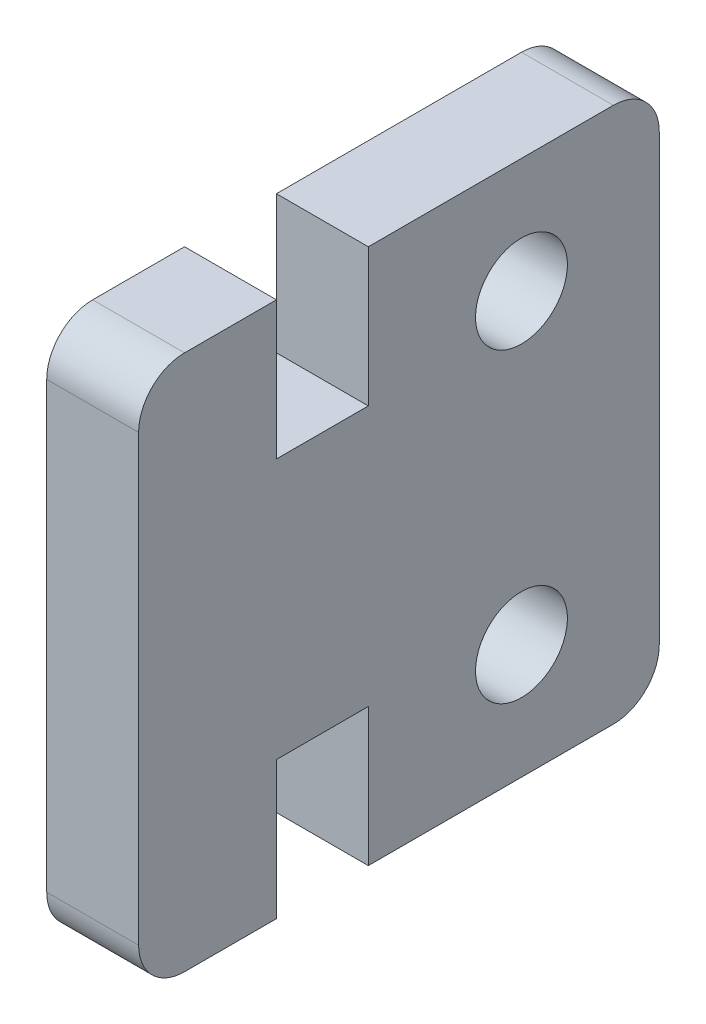
ISO-10303-21;
HEADER;
FILE_DESCRIPTION(('STEP AP214'),'2;1');
FILE_NAME('part.step','',(''),(''),'','','');
FILE_SCHEMA(('AUTOMOTIVE_DESIGN { 1 0 10303 214 1 1 1 1 }'));
ENDSEC;
DATA;
#1=APPLICATION_CONTEXT('core data for automotive mechanical design processes');
#2=APPLICATION_PROTOCOL_DEFINITION('international standard','automotive_design',2000,#1);
#3=PRODUCT_CONTEXT('',#1,'mechanical');
#4=PRODUCT('Part','Part','',(#3));
#5=PRODUCT_RELATED_PRODUCT_CATEGORY('part','',(#4));
#6=PRODUCT_DEFINITION_FORMATION('','',#4);
#7=PRODUCT_DEFINITION_CONTEXT('part definition',#1,'design');
#8=PRODUCT_DEFINITION('design','',#6,#7);
#9=PRODUCT_DEFINITION_SHAPE('','',#8);
#10=(LENGTH_UNIT() NAMED_UNIT(*) SI_UNIT(.MILLI.,.METRE.));
#11=(NAMED_UNIT(*) PLANE_ANGLE_UNIT() SI_UNIT($,.RADIAN.));
#12=(NAMED_UNIT(*) SI_UNIT($,.STERADIAN.) SOLID_ANGLE_UNIT());
#13=UNCERTAINTY_MEASURE_WITH_UNIT(LENGTH_MEASURE(1.E-05),#10,'distance_accuracy_value','');
#14=(GEOMETRIC_REPRESENTATION_CONTEXT(3) GLOBAL_UNCERTAINTY_ASSIGNED_CONTEXT((#13)) GLOBAL_UNIT_ASSIGNED_CONTEXT((#10,
#11,#12)) REPRESENTATION_CONTEXT('',''));
#15=CARTESIAN_POINT('',(0.,0.,0.));
#16=DIRECTION('',(0.,0.,1.));
#17=DIRECTION('',(1.,0.,0.));
#18=AXIS2_PLACEMENT_3D('',#15,#16,#17);
#19=CARTESIAN_POINT('',(3.,0.,0.));
#20=DIRECTION('',(1.,0.,0.));
#21=DIRECTION('',(0.,0.,-1.));
#22=AXIS2_PLACEMENT_3D('',#19,#20,#21);
#23=PLANE('',#22);
#24=CARTESIAN_POINT('',(3.,5.,-5.));
#25=DIRECTION('',(-1.,0.,0.));
#26=DIRECTION('',(0.,0.,1.));
#27=AXIS2_PLACEMENT_3D('',#24,#25,#26);
#28=CIRCLE('',#27,1.5);
#29=CARTESIAN_POINT('',(3.,5.,-3.5));
#30=VERTEX_POINT('',#29);
#31=EDGE_CURVE('E252',#30,#30,#28,.T.);
#32=ORIENTED_EDGE('',*,*,#31,.T.);
#33=EDGE_LOOP('',(#32));
#34=FACE_BOUND('',#33,.T.);
#35=DIRECTION('',(0.,0.,1.));
#36=VECTOR('',#35,1.);
#37=CARTESIAN_POINT('',(3.,-4.25,3.));
#38=LINE('',#37,#36);
#39=CARTESIAN_POINT('',(3.,-4.25,3.));
#40=VERTEX_POINT('',#39);
#41=CARTESIAN_POINT('',(3.,-4.25,0.));
#42=VERTEX_POINT('',#41);
#43=EDGE_CURVE('E171',#40,#42,#38,.F.);
#44=ORIENTED_EDGE('',*,*,#43,.T.);
#45=DIRECTION('',(0.,1.,0.));
#46=VECTOR('',#45,1.);
#47=CARTESIAN_POINT('',(3.,-4.25,0.));
#48=LINE('',#47,#46);
#49=CARTESIAN_POINT('',(3.,-8.75,0.));
#50=VERTEX_POINT('',#49);
#51=EDGE_CURVE('E145',#42,#50,#48,.F.);
#52=ORIENTED_EDGE('',*,*,#51,.T.);
#53=DIRECTION('',(0.,0.,1.));
#54=VECTOR('',#53,1.);
#55=CARTESIAN_POINT('',(3.,-8.75,0.));
#56=LINE('',#55,#54);
#57=CARTESIAN_POINT('',(3.,-8.75,-8.));
#58=VERTEX_POINT('',#57);
#59=EDGE_CURVE('E141',#50,#58,#56,.F.);
#60=ORIENTED_EDGE('',*,*,#59,.T.);
#61=CARTESIAN_POINT('',(3.,-7.25,-8.));
#62=DIRECTION('',(-1.,0.,0.));
#63=DIRECTION('',(0.,0.,1.));
#64=AXIS2_PLACEMENT_3D('',#61,#62,#63);
#65=CIRCLE('',#64,1.5);
#66=CARTESIAN_POINT('',(3.,-7.25,-9.5));
#67=VERTEX_POINT('',#66);
#68=EDGE_CURVE('E254',#67,#58,#65,.T.);
#69=ORIENTED_EDGE('',*,*,#68,.F.);
#70=DIRECTION('',(0.,1.,0.));
#71=VECTOR('',#70,1.);
#72=CARTESIAN_POINT('',(3.,8.75,-9.5));
#73=LINE('',#72,#71);
#74=CARTESIAN_POINT('',(3.,7.25,-9.5));
#75=VERTEX_POINT('',#74);
#76=EDGE_CURVE('E250',#67,#75,#73,.T.);
#77=ORIENTED_EDGE('',*,*,#76,.T.);
#78=CARTESIAN_POINT('',(3.,7.25,-8.));
#79=DIRECTION('',(-1.,0.,0.));
#80=DIRECTION('',(0.,0.,1.));
#81=AXIS2_PLACEMENT_3D('',#78,#79,#80);
#82=CIRCLE('',#81,1.5);
#83=CARTESIAN_POINT('',(3.,8.75,-8.));
#84=VERTEX_POINT('',#83);
#85=EDGE_CURVE('E89',#84,#75,#82,.T.);
#86=ORIENTED_EDGE('',*,*,#85,.F.);
#87=DIRECTION('',(0.,0.,-1.));
#88=VECTOR('',#87,1.);
#89=CARTESIAN_POINT('',(3.,8.75,0.));
#90=LINE('',#89,#88);
#91=CARTESIAN_POINT('',(3.,8.75,0.));
#92=VERTEX_POINT('',#91);
#93=EDGE_CURVE('E93',#84,#92,#90,.F.);
#94=ORIENTED_EDGE('',*,*,#93,.T.);
#95=DIRECTION('',(0.,1.,0.));
#96=VECTOR('',#95,1.);
#97=CARTESIAN_POINT('',(3.,4.25,0.));
#98=LINE('',#97,#96);
#99=CARTESIAN_POINT('',(3.,4.25,0.));
#100=VERTEX_POINT('',#99);
#101=EDGE_CURVE('E234',#92,#100,#98,.F.);
#102=ORIENTED_EDGE('',*,*,#101,.T.);
#103=DIRECTION('',(0.,0.,-1.));
#104=VECTOR('',#103,1.);
#105=CARTESIAN_POINT('',(3.,4.25,3.));
#106=LINE('',#105,#104);
#107=CARTESIAN_POINT('',(3.,4.25,3.));
#108=VERTEX_POINT('',#107);
#109=EDGE_CURVE('E223',#100,#108,#106,.F.);
#110=ORIENTED_EDGE('',*,*,#109,.T.);
#111=DIRECTION('',(0.,1.,0.));
#112=VECTOR('',#111,1.);
#113=CARTESIAN_POINT('',(3.,8.75,3.));
#114=LINE('',#113,#112);
#115=CARTESIAN_POINT('',(3.,8.75,3.));
#116=VERTEX_POINT('',#115);
#117=EDGE_CURVE('E210',#108,#116,#114,.T.);
#118=ORIENTED_EDGE('',*,*,#117,.T.);
#119=DIRECTION('',(0.,0.,-1.));
#120=VECTOR('',#119,1.);
#121=CARTESIAN_POINT('',(3.,8.75,7.5));
#122=LINE('',#121,#120);
#123=CARTESIAN_POINT('',(3.,8.75,6.));
#124=VERTEX_POINT('',#123);
#125=EDGE_CURVE('E209',#116,#124,#122,.F.);
#126=ORIENTED_EDGE('',*,*,#125,.T.);
#127=CARTESIAN_POINT('',(3.,7.25,6.));
#128=DIRECTION('',(-1.,0.,0.));
#129=DIRECTION('',(0.,0.,1.));
#130=AXIS2_PLACEMENT_3D('',#127,#128,#129);
#131=CIRCLE('',#130,1.5);
#132=CARTESIAN_POINT('',(3.,7.25,7.5));
#133=VERTEX_POINT('',#132);
#134=EDGE_CURVE('E205',#133,#124,#131,.T.);
#135=ORIENTED_EDGE('',*,*,#134,.F.);
#136=DIRECTION('',(0.,1.,0.));
#137=VECTOR('',#136,1.);
#138=CARTESIAN_POINT('',(3.,-8.75,7.5));
#139=LINE('',#138,#137);
#140=CARTESIAN_POINT('',(3.,-7.25,7.5));
#141=VERTEX_POINT('',#140);
#142=EDGE_CURVE('E202',#133,#141,#139,.F.);
#143=ORIENTED_EDGE('',*,*,#142,.T.);
#144=CARTESIAN_POINT('',(3.,-7.25,6.));
#145=DIRECTION('',(-1.,0.,0.));
#146=DIRECTION('',(0.,0.,1.));
#147=AXIS2_PLACEMENT_3D('',#144,#145,#146);
#148=CIRCLE('',#147,1.5);
#149=CARTESIAN_POINT('',(3.,-8.75,6.));
#150=VERTEX_POINT('',#149);
#151=EDGE_CURVE('E198',#150,#141,#148,.T.);
#152=ORIENTED_EDGE('',*,*,#151,.F.);
#153=DIRECTION('',(0.,0.,1.));
#154=VECTOR('',#153,1.);
#155=CARTESIAN_POINT('',(3.,-8.75,3.));
#156=LINE('',#155,#154);
#157=CARTESIAN_POINT('',(3.,-8.75,3.));
#158=VERTEX_POINT('',#157);
#159=EDGE_CURVE('E190',#150,#158,#156,.F.);
#160=ORIENTED_EDGE('',*,*,#159,.T.);
#161=DIRECTION('',(0.,1.,0.));
#162=VECTOR('',#161,1.);
#163=CARTESIAN_POINT('',(3.,-4.25,3.));
#164=LINE('',#163,#162);
#165=EDGE_CURVE('E179',#158,#40,#164,.T.);
#166=ORIENTED_EDGE('',*,*,#165,.T.);
#167=EDGE_LOOP('',(#44,#52,#60,#69,#77,#86,#94,#102,#110,#118,#126,#135,#143,#152,#160,#166));
#168=FACE_BOUND('',#167,.T.);
#169=CARTESIAN_POINT('',(3.,-5.,-5.));
#170=DIRECTION('',(-1.,0.,0.));
#171=DIRECTION('',(0.,0.,1.));
#172=AXIS2_PLACEMENT_3D('',#169,#170,#171);
#173=CIRCLE('',#172,1.5);
#174=CARTESIAN_POINT('',(3.,-5.,-3.5));
#175=VERTEX_POINT('',#174);
#176=EDGE_CURVE('E19',#175,#175,#173,.T.);
#177=ORIENTED_EDGE('',*,*,#176,.T.);
#178=EDGE_LOOP('',(#177));
#179=FACE_BOUND('',#178,.T.);
#180=ADVANCED_FACE('F16',(#34,#168,#179),#23,.T.);
#181=CARTESIAN_POINT('',(3.,-5.,-5.));
#182=DIRECTION('',(-1.,0.,0.));
#183=DIRECTION('',(0.,0.,1.));
#184=AXIS2_PLACEMENT_3D('',#181,#182,#183);
#185=CYLINDRICAL_SURFACE('',#184,1.5);
#186=CARTESIAN_POINT('',(0.,-5.,-5.));
#187=DIRECTION('',(-1.,0.,0.));
#188=DIRECTION('',(0.,0.,1.));
#189=AXIS2_PLACEMENT_3D('',#186,#187,#188);
#190=CIRCLE('',#189,1.5);
#191=CARTESIAN_POINT('',(0.,-5.,-3.5));
#192=VERTEX_POINT('',#191);
#193=EDGE_CURVE('E298',#192,#192,#190,.T.);
#194=ORIENTED_EDGE('',*,*,#193,.T.);
#195=EDGE_LOOP('',(#194));
#196=FACE_BOUND('',#195,.T.);
#197=ORIENTED_EDGE('',*,*,#176,.F.);
#198=EDGE_LOOP('',(#197));
#199=FACE_BOUND('',#198,.T.);
#200=ADVANCED_FACE('F313',(#196,#199),#185,.F.);
#201=CARTESIAN_POINT('',(3.,7.25,-8.));
#202=DIRECTION('',(-1.,0.,0.));
#203=DIRECTION('',(0.,0.,1.));
#204=AXIS2_PLACEMENT_3D('',#201,#202,#203);
#205=CYLINDRICAL_SURFACE('',#204,1.5);
#206=CARTESIAN_POINT('',(0.,7.25,-8.));
#207=DIRECTION('',(-1.,0.,0.));
#208=DIRECTION('',(0.,0.,1.));
#209=AXIS2_PLACEMENT_3D('',#206,#207,#208);
#210=CIRCLE('',#209,1.5);
#211=CARTESIAN_POINT('',(0.,7.25,-9.5));
#212=VERTEX_POINT('',#211);
#213=CARTESIAN_POINT('',(0.,8.75,-8.));
#214=VERTEX_POINT('',#213);
#215=EDGE_CURVE('E295',#212,#214,#210,.F.);
#216=ORIENTED_EDGE('',*,*,#215,.T.);
#217=DIRECTION('',(1.,0.,0.));
#218=VECTOR('',#217,1.);
#219=CARTESIAN_POINT('',(3.,8.75,-8.));
#220=LINE('',#219,#218);
#221=EDGE_CURVE('E247',#214,#84,#220,.T.);
#222=ORIENTED_EDGE('',*,*,#221,.T.);
#223=ORIENTED_EDGE('',*,*,#85,.T.);
#224=DIRECTION('',(1.,0.,0.));
#225=VECTOR('',#224,1.);
#226=CARTESIAN_POINT('',(3.,7.25,-9.5));
#227=LINE('',#226,#225);
#228=EDGE_CURVE('E396',#75,#212,#227,.F.);
#229=ORIENTED_EDGE('',*,*,#228,.T.);
#230=EDGE_LOOP('',(#216,#222,#223,#229));
#231=FACE_BOUND('',#230,.T.);
#232=ADVANCED_FACE('F315',(#231),#205,.T.);
#233=CARTESIAN_POINT('',(3.,8.75,0.));
#234=DIRECTION('',(0.,-1.,0.));
#235=DIRECTION('',(0.,0.,-1.));
#236=AXIS2_PLACEMENT_3D('',#233,#234,#235);
#237=PLANE('',#236);
#238=ORIENTED_EDGE('',*,*,#221,.F.);
#239=DIRECTION('',(0.,0.,-1.));
#240=VECTOR('',#239,1.);
#241=CARTESIAN_POINT('',(0.,8.75,0.));
#242=LINE('',#241,#240);
#243=CARTESIAN_POINT('',(0.,8.75,0.));
#244=VERTEX_POINT('',#243);
#245=EDGE_CURVE('E239',#214,#244,#242,.F.);
#246=ORIENTED_EDGE('',*,*,#245,.T.);
#247=DIRECTION('',(1.,0.,0.));
#248=VECTOR('',#247,1.);
#249=CARTESIAN_POINT('',(3.,8.75,0.));
#250=LINE('',#249,#248);
#251=EDGE_CURVE('E242',#244,#92,#250,.T.);
#252=ORIENTED_EDGE('',*,*,#251,.T.);
#253=ORIENTED_EDGE('',*,*,#93,.F.);
#254=EDGE_LOOP('',(#238,#246,#252,#253));
#255=FACE_BOUND('',#254,.T.);
#256=ADVANCED_FACE('F322',(#255),#237,.F.);
#257=CARTESIAN_POINT('',(3.,4.25,0.));
#258=DIRECTION('',(0.,0.,-1.));
#259=DIRECTION('',(0.,1.,0.));
#260=AXIS2_PLACEMENT_3D('',#257,#258,#259);
#261=PLANE('',#260);
#262=DIRECTION('',(1.,0.,0.));
#263=VECTOR('',#262,1.);
#264=CARTESIAN_POINT('',(3.,4.25,0.));
#265=LINE('',#264,#263);
#266=CARTESIAN_POINT('',(0.,4.25,0.));
#267=VERTEX_POINT('',#266);
#268=EDGE_CURVE('E231',#267,#100,#265,.T.);
#269=ORIENTED_EDGE('',*,*,#268,.T.);
#270=ORIENTED_EDGE('',*,*,#101,.F.);
#271=ORIENTED_EDGE('',*,*,#251,.F.);
#272=DIRECTION('',(0.,1.,0.));
#273=VECTOR('',#272,1.);
#274=CARTESIAN_POINT('',(0.,0.,0.));
#275=LINE('',#274,#273);
#276=EDGE_CURVE('E228',#244,#267,#275,.F.);
#277=ORIENTED_EDGE('',*,*,#276,.T.);
#278=EDGE_LOOP('',(#269,#270,#271,#277));
#279=FACE_BOUND('',#278,.T.);
#280=ADVANCED_FACE('F382',(#279),#261,.F.);
#281=CARTESIAN_POINT('',(3.,4.25,3.));
#282=DIRECTION('',(0.,-1.,0.));
#283=DIRECTION('',(0.,0.,-1.));
#284=AXIS2_PLACEMENT_3D('',#281,#282,#283);
#285=PLANE('',#284);
#286=DIRECTION('',(1.,0.,0.));
#287=VECTOR('',#286,1.);
#288=CARTESIAN_POINT('',(3.,4.25,3.));
#289=LINE('',#288,#287);
#290=CARTESIAN_POINT('',(0.,4.25,3.));
#291=VERTEX_POINT('',#290);
#292=EDGE_CURVE('E220',#291,#108,#289,.T.);
#293=ORIENTED_EDGE('',*,*,#292,.T.);
#294=ORIENTED_EDGE('',*,*,#109,.F.);
#295=ORIENTED_EDGE('',*,*,#268,.F.);
#296=DIRECTION('',(0.,0.,-1.));
#297=VECTOR('',#296,1.);
#298=CARTESIAN_POINT('',(0.,4.25,0.));
#299=LINE('',#298,#297);
#300=EDGE_CURVE('E217',#267,#291,#299,.F.);
#301=ORIENTED_EDGE('',*,*,#300,.T.);
#302=EDGE_LOOP('',(#293,#294,#295,#301));
#303=FACE_BOUND('',#302,.T.);
#304=ADVANCED_FACE('F378',(#303),#285,.F.);
#305=CARTESIAN_POINT('',(3.,8.75,3.));
#306=DIRECTION('',(0.,0.,1.));
#307=DIRECTION('',(1.,0.,0.));
#308=AXIS2_PLACEMENT_3D('',#305,#306,#307);
#309=PLANE('',#308);
#310=DIRECTION('',(1.,0.,0.));
#311=VECTOR('',#310,1.);
#312=CARTESIAN_POINT('',(3.,8.75,3.));
#313=LINE('',#312,#311);
#314=CARTESIAN_POINT('',(0.,8.75,3.));
#315=VERTEX_POINT('',#314);
#316=EDGE_CURVE('E206',#315,#116,#313,.T.);
#317=ORIENTED_EDGE('',*,*,#316,.T.);
#318=ORIENTED_EDGE('',*,*,#117,.F.);
#319=ORIENTED_EDGE('',*,*,#292,.F.);
#320=DIRECTION('',(0.,1.,0.));
#321=VECTOR('',#320,1.);
#322=CARTESIAN_POINT('',(0.,0.,3.));
#323=LINE('',#322,#321);
#324=EDGE_CURVE('E213',#291,#315,#323,.T.);
#325=ORIENTED_EDGE('',*,*,#324,.T.);
#326=EDGE_LOOP('',(#317,#318,#319,#325));
#327=FACE_BOUND('',#326,.T.);
#328=ADVANCED_FACE('F374',(#327),#309,.F.);
#329=CARTESIAN_POINT('',(3.,8.75,7.5));
#330=DIRECTION('',(0.,-1.,0.));
#331=DIRECTION('',(0.,0.,-1.));
#332=AXIS2_PLACEMENT_3D('',#329,#330,#331);
#333=PLANE('',#332);
#334=DIRECTION('',(-1.,0.,0.));
#335=VECTOR('',#334,1.);
#336=CARTESIAN_POINT('',(3.,8.75,6.));
#337=LINE('',#336,#335);
#338=CARTESIAN_POINT('',(0.,8.75,6.));
#339=VERTEX_POINT('',#338);
#340=EDGE_CURVE('E203',#124,#339,#337,.T.);
#341=ORIENTED_EDGE('',*,*,#340,.F.);
#342=ORIENTED_EDGE('',*,*,#125,.F.);
#343=ORIENTED_EDGE('',*,*,#316,.F.);
#344=DIRECTION('',(0.,0.,-1.));
#345=VECTOR('',#344,1.);
#346=CARTESIAN_POINT('',(0.,8.75,0.));
#347=LINE('',#346,#345);
#348=EDGE_CURVE('E216',#315,#339,#347,.F.);
#349=ORIENTED_EDGE('',*,*,#348,.T.);
#350=EDGE_LOOP('',(#341,#342,#343,#349));
#351=FACE_BOUND('',#350,.T.);
#352=ADVANCED_FACE('F370',(#351),#333,.F.);
#353=CARTESIAN_POINT('',(3.,7.25,6.));
#354=DIRECTION('',(-1.,0.,0.));
#355=DIRECTION('',(0.,0.,1.));
#356=AXIS2_PLACEMENT_3D('',#353,#354,#355);
#357=CYLINDRICAL_SURFACE('',#356,1.5);
#358=CARTESIAN_POINT('',(0.,7.25,6.));
#359=DIRECTION('',(-1.,0.,0.));
#360=DIRECTION('',(0.,0.,1.));
#361=AXIS2_PLACEMENT_3D('',#358,#359,#360);
#362=CIRCLE('',#361,1.5);
#363=CARTESIAN_POINT('',(0.,7.25,7.5));
#364=VERTEX_POINT('',#363);
#365=EDGE_CURVE('E292',#339,#364,#362,.F.);
#366=ORIENTED_EDGE('',*,*,#365,.T.);
#367=DIRECTION('',(-1.,0.,0.));
#368=VECTOR('',#367,1.);
#369=CARTESIAN_POINT('',(3.,7.25,7.5));
#370=LINE('',#369,#368);
#371=EDGE_CURVE('E199',#364,#133,#370,.F.);
#372=ORIENTED_EDGE('',*,*,#371,.T.);
#373=ORIENTED_EDGE('',*,*,#134,.T.);
#374=ORIENTED_EDGE('',*,*,#340,.T.);
#375=EDGE_LOOP('',(#366,#372,#373,#374));
#376=FACE_BOUND('',#375,.T.);
#377=ADVANCED_FACE('F366',(#376),#357,.T.);
#378=CARTESIAN_POINT('',(3.,-8.75,7.5));
#379=DIRECTION('',(0.,0.,-1.));
#380=DIRECTION('',(-1.,0.,0.));
#381=AXIS2_PLACEMENT_3D('',#378,#379,#380);
#382=PLANE('',#381);
#383=DIRECTION('',(-1.,0.,0.));
#384=VECTOR('',#383,1.);
#385=CARTESIAN_POINT('',(3.,-7.25,7.5));
#386=LINE('',#385,#384);
#387=CARTESIAN_POINT('',(0.,-7.25,7.5));
#388=VERTEX_POINT('',#387);
#389=EDGE_CURVE('E196',#141,#388,#386,.T.);
#390=ORIENTED_EDGE('',*,*,#389,.F.);
#391=ORIENTED_EDGE('',*,*,#142,.F.);
#392=ORIENTED_EDGE('',*,*,#371,.F.);
#393=DIRECTION('',(0.,1.,0.));
#394=VECTOR('',#393,1.);
#395=CARTESIAN_POINT('',(0.,0.,7.5));
#396=LINE('',#395,#394);
#397=EDGE_CURVE('E291',#364,#388,#396,.F.);
#398=ORIENTED_EDGE('',*,*,#397,.T.);
#399=EDGE_LOOP('',(#390,#391,#392,#398));
#400=FACE_BOUND('',#399,.T.);
#401=ADVANCED_FACE('F362',(#400),#382,.F.);
#402=CARTESIAN_POINT('',(3.,-7.25,6.));
#403=DIRECTION('',(-1.,0.,0.));
#404=DIRECTION('',(0.,0.,1.));
#405=AXIS2_PLACEMENT_3D('',#402,#403,#404);
#406=CYLINDRICAL_SURFACE('',#405,1.5);
#407=CARTESIAN_POINT('',(0.,-7.25,6.));
#408=DIRECTION('',(-1.,0.,0.));
#409=DIRECTION('',(0.,0.,1.));
#410=AXIS2_PLACEMENT_3D('',#407,#408,#409);
#411=CIRCLE('',#410,1.5);
#412=CARTESIAN_POINT('',(0.,-8.75,6.));
#413=VERTEX_POINT('',#412);
#414=EDGE_CURVE('E288',#388,#413,#411,.F.);
#415=ORIENTED_EDGE('',*,*,#414,.T.);
#416=DIRECTION('',(1.,0.,0.));
#417=VECTOR('',#416,1.);
#418=CARTESIAN_POINT('',(3.,-8.75,6.));
#419=LINE('',#418,#417);
#420=EDGE_CURVE('E193',#413,#150,#419,.T.);
#421=ORIENTED_EDGE('',*,*,#420,.T.);
#422=ORIENTED_EDGE('',*,*,#151,.T.);
#423=ORIENTED_EDGE('',*,*,#389,.T.);
#424=EDGE_LOOP('',(#415,#421,#422,#423));
#425=FACE_BOUND('',#424,.T.);
#426=ADVANCED_FACE('F358',(#425),#406,.T.);
#427=CARTESIAN_POINT('',(3.,-8.75,3.));
#428=DIRECTION('',(0.,1.,0.));
#429=DIRECTION('',(0.,0.,1.));
#430=AXIS2_PLACEMENT_3D('',#427,#428,#429);
#431=PLANE('',#430);
#432=ORIENTED_EDGE('',*,*,#420,.F.);
#433=DIRECTION('',(0.,0.,-1.));
#434=VECTOR('',#433,1.);
#435=CARTESIAN_POINT('',(0.,-8.75,0.));
#436=LINE('',#435,#434);
#437=CARTESIAN_POINT('',(0.,-8.75,3.));
#438=VERTEX_POINT('',#437);
#439=EDGE_CURVE('E184',#413,#438,#436,.T.);
#440=ORIENTED_EDGE('',*,*,#439,.T.);
#441=DIRECTION('',(1.,0.,0.));
#442=VECTOR('',#441,1.);
#443=CARTESIAN_POINT('',(3.,-8.75,3.));
#444=LINE('',#443,#442);
#445=EDGE_CURVE('E187',#438,#158,#444,.T.);
#446=ORIENTED_EDGE('',*,*,#445,.T.);
#447=ORIENTED_EDGE('',*,*,#159,.F.);
#448=EDGE_LOOP('',(#432,#440,#446,#447));
#449=FACE_BOUND('',#448,.T.);
#450=ADVANCED_FACE('F354',(#449),#431,.F.);
#451=CARTESIAN_POINT('',(3.,-4.25,3.));
#452=DIRECTION('',(0.,0.,1.));
#453=DIRECTION('',(1.,0.,0.));
#454=AXIS2_PLACEMENT_3D('',#451,#452,#453);
#455=PLANE('',#454);
#456=DIRECTION('',(1.,0.,0.));
#457=VECTOR('',#456,1.);
#458=CARTESIAN_POINT('',(3.,-4.25,3.));
#459=LINE('',#458,#457);
#460=CARTESIAN_POINT('',(0.,-4.25,3.));
#461=VERTEX_POINT('',#460);
#462=EDGE_CURVE('E176',#461,#40,#459,.T.);
#463=ORIENTED_EDGE('',*,*,#462,.T.);
#464=ORIENTED_EDGE('',*,*,#165,.F.);
#465=ORIENTED_EDGE('',*,*,#445,.F.);
#466=DIRECTION('',(0.,1.,0.));
#467=VECTOR('',#466,1.);
#468=CARTESIAN_POINT('',(0.,0.,3.));
#469=LINE('',#468,#467);
#470=EDGE_CURVE('E163',#438,#461,#469,.T.);
#471=ORIENTED_EDGE('',*,*,#470,.T.);
#472=EDGE_LOOP('',(#463,#464,#465,#471));
#473=FACE_BOUND('',#472,.T.);
#474=ADVANCED_FACE('F350',(#473),#455,.F.);
#475=CARTESIAN_POINT('',(3.,-4.25,3.));
#476=DIRECTION('',(0.,1.,0.));
#477=DIRECTION('',(0.,0.,1.));
#478=AXIS2_PLACEMENT_3D('',#475,#476,#477);
#479=PLANE('',#478);
#480=DIRECTION('',(1.,0.,0.));
#481=VECTOR('',#480,1.);
#482=CARTESIAN_POINT('',(3.,-4.25,0.));
#483=LINE('',#482,#481);
#484=CARTESIAN_POINT('',(0.,-4.25,0.));
#485=VERTEX_POINT('',#484);
#486=EDGE_CURVE('E160',#485,#42,#483,.T.);
#487=ORIENTED_EDGE('',*,*,#486,.T.);
#488=ORIENTED_EDGE('',*,*,#43,.F.);
#489=ORIENTED_EDGE('',*,*,#462,.F.);
#490=DIRECTION('',(0.,0.,-1.));
#491=VECTOR('',#490,1.);
#492=CARTESIAN_POINT('',(0.,-4.25,0.));
#493=LINE('',#492,#491);
#494=EDGE_CURVE('E161',#461,#485,#493,.T.);
#495=ORIENTED_EDGE('',*,*,#494,.T.);
#496=EDGE_LOOP('',(#487,#488,#489,#495));
#497=FACE_BOUND('',#496,.T.);
#498=ADVANCED_FACE('F347',(#497),#479,.F.);
#499=CARTESIAN_POINT('',(3.,-4.25,0.));
#500=DIRECTION('',(0.,0.,-1.));
#501=DIRECTION('',(0.,1.,0.));
#502=AXIS2_PLACEMENT_3D('',#499,#500,#501);
#503=PLANE('',#502);
#504=DIRECTION('',(1.,0.,0.));
#505=VECTOR('',#504,1.);
#506=CARTESIAN_POINT('',(3.,-8.75,0.));
#507=LINE('',#506,#505);
#508=CARTESIAN_POINT('',(0.,-8.75,0.));
#509=VERTEX_POINT('',#508);
#510=EDGE_CURVE('E135',#509,#50,#507,.T.);
#511=ORIENTED_EDGE('',*,*,#510,.T.);
#512=ORIENTED_EDGE('',*,*,#51,.F.);
#513=ORIENTED_EDGE('',*,*,#486,.F.);
#514=DIRECTION('',(0.,1.,0.));
#515=VECTOR('',#514,1.);
#516=CARTESIAN_POINT('',(0.,0.,0.));
#517=LINE('',#516,#515);
#518=EDGE_CURVE('E153',#485,#509,#517,.F.);
#519=ORIENTED_EDGE('',*,*,#518,.T.);
#520=EDGE_LOOP('',(#511,#512,#513,#519));
#521=FACE_BOUND('',#520,.T.);
#522=ADVANCED_FACE('F158',(#521),#503,.F.);
#523=CARTESIAN_POINT('',(3.,-8.75,0.));
#524=DIRECTION('',(0.,1.,0.));
#525=DIRECTION('',(0.,0.,1.));
#526=AXIS2_PLACEMENT_3D('',#523,#524,#525);
#527=PLANE('',#526);
#528=DIRECTION('',(-1.,0.,0.));
#529=VECTOR('',#528,1.);
#530=CARTESIAN_POINT('',(3.,-8.75,-8.));
#531=LINE('',#530,#529);
#532=CARTESIAN_POINT('',(0.,-8.75,-8.));
#533=VERTEX_POINT('',#532);
#534=EDGE_CURVE('E304',#58,#533,#531,.T.);
#535=ORIENTED_EDGE('',*,*,#534,.F.);
#536=ORIENTED_EDGE('',*,*,#59,.F.);
#537=ORIENTED_EDGE('',*,*,#510,.F.);
#538=DIRECTION('',(0.,0.,-1.));
#539=VECTOR('',#538,1.);
#540=CARTESIAN_POINT('',(0.,-8.75,0.));
#541=LINE('',#540,#539);
#542=EDGE_CURVE('E139',#509,#533,#541,.T.);
#543=ORIENTED_EDGE('',*,*,#542,.T.);
#544=EDGE_LOOP('',(#535,#536,#537,#543));
#545=FACE_BOUND('',#544,.T.);
#546=ADVANCED_FACE('F138',(#545),#527,.F.);
#547=CARTESIAN_POINT('',(3.,-7.25,-8.));
#548=DIRECTION('',(-1.,0.,0.));
#549=DIRECTION('',(0.,0.,1.));
#550=AXIS2_PLACEMENT_3D('',#547,#548,#549);
#551=CYLINDRICAL_SURFACE('',#550,1.5);
#552=CARTESIAN_POINT('',(0.,-7.25,-8.));
#553=DIRECTION('',(-1.,0.,0.));
#554=DIRECTION('',(0.,0.,1.));
#555=AXIS2_PLACEMENT_3D('',#552,#553,#554);
#556=CIRCLE('',#555,1.5);
#557=CARTESIAN_POINT('',(0.,-7.25,-9.5));
#558=VERTEX_POINT('',#557);
#559=EDGE_CURVE('E156',#533,#558,#556,.F.);
#560=ORIENTED_EDGE('',*,*,#559,.T.);
#561=DIRECTION('',(1.,0.,0.));
#562=VECTOR('',#561,1.);
#563=CARTESIAN_POINT('',(3.,-7.25,-9.5));
#564=LINE('',#563,#562);
#565=EDGE_CURVE('E34',#558,#67,#564,.T.);
#566=ORIENTED_EDGE('',*,*,#565,.T.);
#567=ORIENTED_EDGE('',*,*,#68,.T.);
#568=ORIENTED_EDGE('',*,*,#534,.T.);
#569=EDGE_LOOP('',(#560,#566,#567,#568));
#570=FACE_BOUND('',#569,.T.);
#571=ADVANCED_FACE('F339',(#570),#551,.T.);
#572=CARTESIAN_POINT('',(3.,8.75,-9.5));
#573=DIRECTION('',(0.,0.,1.));
#574=DIRECTION('',(1.,0.,0.));
#575=AXIS2_PLACEMENT_3D('',#572,#573,#574);
#576=PLANE('',#575);
#577=ORIENTED_EDGE('',*,*,#565,.F.);
#578=DIRECTION('',(0.,1.,0.));
#579=VECTOR('',#578,1.);
#580=CARTESIAN_POINT('',(0.,0.,-9.5));
#581=LINE('',#580,#579);
#582=EDGE_CURVE('E25',#558,#212,#581,.T.);
#583=ORIENTED_EDGE('',*,*,#582,.T.);
#584=ORIENTED_EDGE('',*,*,#228,.F.);
#585=ORIENTED_EDGE('',*,*,#76,.F.);
#586=EDGE_LOOP('',(#577,#583,#584,#585));
#587=FACE_BOUND('',#586,.T.);
#588=ADVANCED_FACE('F332',(#587),#576,.F.);
#589=CARTESIAN_POINT('',(3.,5.,-5.));
#590=DIRECTION('',(-1.,0.,0.));
#591=DIRECTION('',(0.,0.,1.));
#592=AXIS2_PLACEMENT_3D('',#589,#590,#591);
#593=CYLINDRICAL_SURFACE('',#592,1.5);
#594=CARTESIAN_POINT('',(0.,5.,-5.));
#595=DIRECTION('',(-1.,0.,0.));
#596=DIRECTION('',(0.,0.,1.));
#597=AXIS2_PLACEMENT_3D('',#594,#595,#596);
#598=CIRCLE('',#597,1.5);
#599=CARTESIAN_POINT('',(0.,5.,-3.5));
#600=VERTEX_POINT('',#599);
#601=EDGE_CURVE('E11',#600,#600,#598,.T.);
#602=ORIENTED_EDGE('',*,*,#601,.T.);
#603=EDGE_LOOP('',(#602));
#604=FACE_BOUND('',#603,.T.);
#605=ORIENTED_EDGE('',*,*,#31,.F.);
#606=EDGE_LOOP('',(#605));
#607=FACE_BOUND('',#606,.T.);
#608=ADVANCED_FACE('F326',(#604,#607),#593,.F.);
#609=CARTESIAN_POINT('',(0.,0.,0.));
#610=DIRECTION('',(1.,0.,0.));
#611=DIRECTION('',(0.,0.,-1.));
#612=AXIS2_PLACEMENT_3D('',#609,#610,#611);
#613=PLANE('',#612);
#614=ORIENTED_EDGE('',*,*,#601,.F.);
#615=EDGE_LOOP('',(#614));
#616=FACE_BOUND('',#615,.T.);
#617=ORIENTED_EDGE('',*,*,#559,.F.);
#618=ORIENTED_EDGE('',*,*,#542,.F.);
#619=ORIENTED_EDGE('',*,*,#518,.F.);
#620=ORIENTED_EDGE('',*,*,#494,.F.);
#621=ORIENTED_EDGE('',*,*,#470,.F.);
#622=ORIENTED_EDGE('',*,*,#439,.F.);
#623=ORIENTED_EDGE('',*,*,#414,.F.);
#624=ORIENTED_EDGE('',*,*,#397,.F.);
#625=ORIENTED_EDGE('',*,*,#365,.F.);
#626=ORIENTED_EDGE('',*,*,#348,.F.);
#627=ORIENTED_EDGE('',*,*,#324,.F.);
#628=ORIENTED_EDGE('',*,*,#300,.F.);
#629=ORIENTED_EDGE('',*,*,#276,.F.);
#630=ORIENTED_EDGE('',*,*,#245,.F.);
#631=ORIENTED_EDGE('',*,*,#215,.F.);
#632=ORIENTED_EDGE('',*,*,#582,.F.);
#633=EDGE_LOOP('',(#617,#618,#619,#620,#621,#622,#623,#624,#625,#626,#627,#628,#629,#630,#631,#632));
#634=FACE_BOUND('',#633,.T.);
#635=ORIENTED_EDGE('',*,*,#193,.F.);
#636=EDGE_LOOP('',(#635));
#637=FACE_BOUND('',#636,.T.);
#638=ADVANCED_FACE('F150',(#616,#634,#637),#613,.F.);
#639=CLOSED_SHELL('',(#180,#200,#232,#256,#280,#304,#328,#352,#377,#401,#426,#450,#474,#498,
#522,#546,#571,#588,#608,#638));
#640=MANIFOLD_SOLID_BREP('B1',#639);
#641=ADVANCED_BREP_SHAPE_REPRESENTATION('',(#18,#640),#14);
#642=SHAPE_DEFINITION_REPRESENTATION(#9,#641);
ENDSEC;
END-ISO-10303-21;
